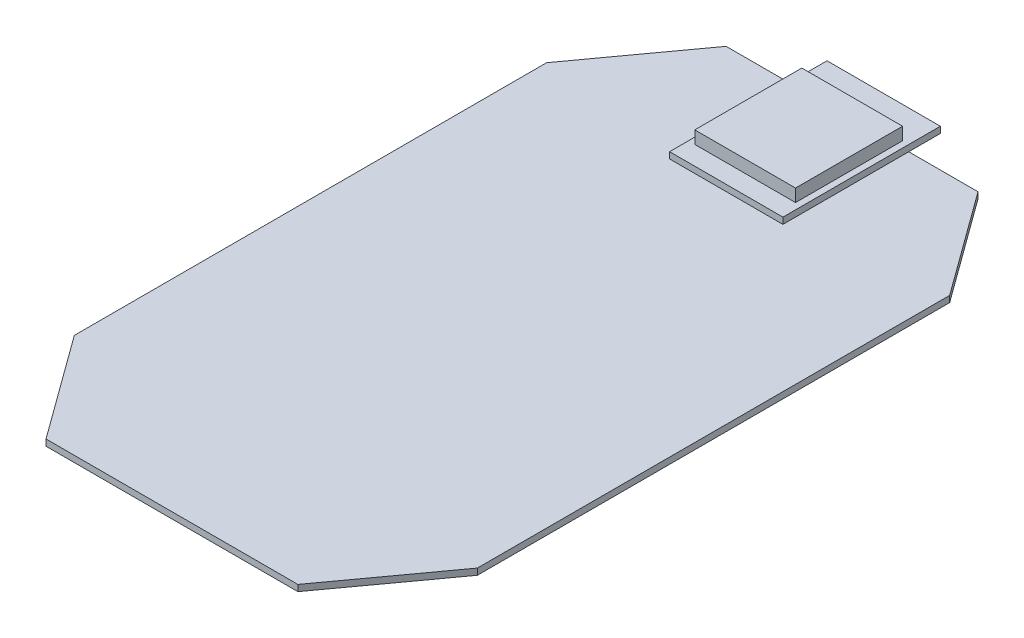
ISO-10303-21;
HEADER;
FILE_DESCRIPTION(('STEP AP214'),'2;1');
FILE_NAME('part.step','',(''),(''),'','','');
FILE_SCHEMA(('AUTOMOTIVE_DESIGN { 1 0 10303 214 1 1 1 1 }'));
ENDSEC;
DATA;
#1=APPLICATION_CONTEXT('core data for automotive mechanical design processes');
#2=APPLICATION_PROTOCOL_DEFINITION('international standard','automotive_design',2000,#1);
#3=PRODUCT_CONTEXT('',#1,'mechanical');
#4=PRODUCT('Part','Part','',(#3));
#5=PRODUCT_RELATED_PRODUCT_CATEGORY('part','',(#4));
#6=PRODUCT_DEFINITION_FORMATION('','',#4);
#7=PRODUCT_DEFINITION_CONTEXT('part definition',#1,'design');
#8=PRODUCT_DEFINITION('design','',#6,#7);
#9=PRODUCT_DEFINITION_SHAPE('','',#8);
#10=(LENGTH_UNIT() NAMED_UNIT(*) SI_UNIT(.MILLI.,.METRE.));
#11=(NAMED_UNIT(*) PLANE_ANGLE_UNIT() SI_UNIT($,.RADIAN.));
#12=(NAMED_UNIT(*) SI_UNIT($,.STERADIAN.) SOLID_ANGLE_UNIT());
#13=UNCERTAINTY_MEASURE_WITH_UNIT(LENGTH_MEASURE(1.E-05),#10,'distance_accuracy_value','');
#14=(GEOMETRIC_REPRESENTATION_CONTEXT(3) GLOBAL_UNCERTAINTY_ASSIGNED_CONTEXT((#13)) GLOBAL_UNIT_ASSIGNED_CONTEXT((#10,
#11,#12)) REPRESENTATION_CONTEXT('',''));
#15=CARTESIAN_POINT('',(0.,0.,0.));
#16=DIRECTION('',(0.,0.,1.));
#17=DIRECTION('',(1.,0.,0.));
#18=AXIS2_PLACEMENT_3D('',#15,#16,#17);
#19=CARTESIAN_POINT('',(-51.372972972973,1.,-37.3621621621621));
#20=DIRECTION('',(-0.808736084303189,0.,-0.588171697675046));
#21=DIRECTION('',(-0.588171697675046,0.,0.808736084303189));
#22=AXIS2_PLACEMENT_3D('',#19,#20,#21);
#23=PLANE('',#22);
#24=DIRECTION('',(0.588171697675046,0.,-0.808736084303189));
#25=VECTOR('',#24,1.);
#26=CARTESIAN_POINT('',(-51.372972972973,0.,-37.3621621621621));
#27=LINE('',#26,#25);
#28=CARTESIAN_POINT('',(-12.,0.,-91.5));
#29=VERTEX_POINT('',#28);
#30=CARTESIAN_POINT('',(0.,0.,-108.));
#31=VERTEX_POINT('',#30);
#32=EDGE_CURVE('E214',#29,#31,#27,.T.);
#33=ORIENTED_EDGE('',*,*,#32,.F.);
#34=DIRECTION('',(0.,-1.,0.));
#35=VECTOR('',#34,1.);
#36=CARTESIAN_POINT('',(-12.,1.,-91.5));
#37=LINE('',#36,#35);
#38=CARTESIAN_POINT('',(-12.,1.,-91.5));
#39=VERTEX_POINT('',#38);
#40=EDGE_CURVE('E45',#39,#29,#37,.T.);
#41=ORIENTED_EDGE('',*,*,#40,.F.);
#42=DIRECTION('',(0.588171697675046,0.,-0.808736084303189));
#43=VECTOR('',#42,1.);
#44=CARTESIAN_POINT('',(-51.372972972973,1.,-37.3621621621621));
#45=LINE('',#44,#43);
#46=CARTESIAN_POINT('',(0.,1.,-108.));
#47=VERTEX_POINT('',#46);
#48=EDGE_CURVE('E239',#39,#47,#45,.T.);
#49=ORIENTED_EDGE('',*,*,#48,.T.);
#50=DIRECTION('',(0.,-1.,0.));
#51=VECTOR('',#50,1.);
#52=CARTESIAN_POINT('',(0.,1.,-108.));
#53=LINE('',#52,#51);
#54=EDGE_CURVE('E180',#47,#31,#53,.T.);
#55=ORIENTED_EDGE('',*,*,#54,.T.);
#56=EDGE_LOOP('',(#33,#41,#49,#55));
#57=FACE_BOUND('',#56,.T.);
#58=ADVANCED_FACE('F38',(#57),#23,.T.);
#59=CARTESIAN_POINT('',(-12.,1.,0.));
#60=DIRECTION('',(-1.,0.,0.));
#61=DIRECTION('',(0.,0.,1.));
#62=AXIS2_PLACEMENT_3D('',#59,#60,#61);
#63=PLANE('',#62);
#64=DIRECTION('',(0.,0.,-1.));
#65=VECTOR('',#64,1.);
#66=CARTESIAN_POINT('',(-12.,0.,0.));
#67=LINE('',#66,#65);
#68=CARTESIAN_POINT('',(-12.,0.,-16.5));
#69=VERTEX_POINT('',#68);
#70=EDGE_CURVE('E207',#69,#29,#67,.T.);
#71=ORIENTED_EDGE('',*,*,#70,.F.);
#72=DIRECTION('',(0.,-1.,0.));
#73=VECTOR('',#72,1.);
#74=CARTESIAN_POINT('',(-12.,1.,-16.5));
#75=LINE('',#74,#73);
#76=CARTESIAN_POINT('',(-12.,1.,-16.5));
#77=VERTEX_POINT('',#76);
#78=EDGE_CURVE('E200',#77,#69,#75,.T.);
#79=ORIENTED_EDGE('',*,*,#78,.F.);
#80=DIRECTION('',(0.,0.,-1.));
#81=VECTOR('',#80,1.);
#82=CARTESIAN_POINT('',(-12.,1.,0.));
#83=LINE('',#82,#81);
#84=EDGE_CURVE('E209',#77,#39,#83,.T.);
#85=ORIENTED_EDGE('',*,*,#84,.T.);
#86=ORIENTED_EDGE('',*,*,#40,.T.);
#87=EDGE_LOOP('',(#71,#79,#85,#86));
#88=FACE_BOUND('',#87,.T.);
#89=ADVANCED_FACE('F205',(#88),#63,.T.);
#90=CARTESIAN_POINT('',(0.,1.,0.));
#91=DIRECTION('',(0.808736084303189,0.,-0.588171697675046));
#92=DIRECTION('',(-0.588171697675046,0.,-0.808736084303189));
#93=AXIS2_PLACEMENT_3D('',#90,#91,#92);
#94=PLANE('',#93);
#95=DIRECTION('',(0.588171697675046,0.,0.808736084303189));
#96=VECTOR('',#95,1.);
#97=CARTESIAN_POINT('',(0.,0.,0.));
#98=LINE('',#97,#96);
#99=CARTESIAN_POINT('',(0.,0.,0.));
#100=VERTEX_POINT('',#99);
#101=EDGE_CURVE('E223',#69,#100,#98,.T.);
#102=ORIENTED_EDGE('',*,*,#101,.T.);
#103=DIRECTION('',(0.,-1.,0.));
#104=VECTOR('',#103,1.);
#105=CARTESIAN_POINT('',(0.,1.,0.));
#106=LINE('',#105,#104);
#107=CARTESIAN_POINT('',(0.,1.,0.));
#108=VERTEX_POINT('',#107);
#109=EDGE_CURVE('E197',#108,#100,#106,.T.);
#110=ORIENTED_EDGE('',*,*,#109,.F.);
#111=DIRECTION('',(0.588171697675046,0.,0.808736084303189));
#112=VECTOR('',#111,1.);
#113=CARTESIAN_POINT('',(0.,1.,0.));
#114=LINE('',#113,#112);
#115=EDGE_CURVE('E242',#77,#108,#114,.T.);
#116=ORIENTED_EDGE('',*,*,#115,.F.);
#117=ORIENTED_EDGE('',*,*,#78,.T.);
#118=EDGE_LOOP('',(#102,#110,#116,#117));
#119=FACE_BOUND('',#118,.T.);
#120=ADVANCED_FACE('F276',(#119),#94,.F.);
#121=CARTESIAN_POINT('',(0.,1.,0.));
#122=DIRECTION('',(0.,0.,-1.));
#123=DIRECTION('',(-1.,0.,0.));
#124=AXIS2_PLACEMENT_3D('',#121,#122,#123);
#125=PLANE('',#124);
#126=DIRECTION('',(1.,0.,0.));
#127=VECTOR('',#126,1.);
#128=CARTESIAN_POINT('',(0.,0.,0.));
#129=LINE('',#128,#127);
#130=CARTESIAN_POINT('',(40.,0.,0.));
#131=VERTEX_POINT('',#130);
#132=EDGE_CURVE('E225',#100,#131,#129,.T.);
#133=ORIENTED_EDGE('',*,*,#132,.T.);
#134=DIRECTION('',(0.,-1.,0.));
#135=VECTOR('',#134,1.);
#136=CARTESIAN_POINT('',(40.,1.,0.));
#137=LINE('',#136,#135);
#138=CARTESIAN_POINT('',(40.,1.,0.));
#139=VERTEX_POINT('',#138);
#140=EDGE_CURVE('E195',#139,#131,#137,.T.);
#141=ORIENTED_EDGE('',*,*,#140,.F.);
#142=DIRECTION('',(1.,0.,0.));
#143=VECTOR('',#142,1.);
#144=CARTESIAN_POINT('',(0.,1.,0.));
#145=LINE('',#144,#143);
#146=EDGE_CURVE('E248',#108,#139,#145,.T.);
#147=ORIENTED_EDGE('',*,*,#146,.F.);
#148=ORIENTED_EDGE('',*,*,#109,.T.);
#149=EDGE_LOOP('',(#133,#141,#147,#148));
#150=FACE_BOUND('',#149,.T.);
#151=ADVANCED_FACE('F280',(#150),#125,.F.);
#152=CARTESIAN_POINT('',(26.1621621621621,1.,19.027027027027));
#153=DIRECTION('',(0.808736084303188,0.,0.588171697675047));
#154=DIRECTION('',(0.588171697675047,0.,-0.808736084303188));
#155=AXIS2_PLACEMENT_3D('',#152,#153,#154);
#156=PLANE('',#155);
#157=DIRECTION('',(-0.588171697675047,0.,0.808736084303188));
#158=VECTOR('',#157,1.);
#159=CARTESIAN_POINT('',(26.1621621621621,0.,19.027027027027));
#160=LINE('',#159,#158);
#161=CARTESIAN_POINT('',(52.,0.,-16.5));
#162=VERTEX_POINT('',#161);
#163=EDGE_CURVE('E231',#162,#131,#160,.T.);
#164=ORIENTED_EDGE('',*,*,#163,.F.);
#165=DIRECTION('',(0.,-1.,0.));
#166=VECTOR('',#165,1.);
#167=CARTESIAN_POINT('',(52.,1.,-16.5));
#168=LINE('',#167,#166);
#169=CARTESIAN_POINT('',(52.,1.,-16.5));
#170=VERTEX_POINT('',#169);
#171=EDGE_CURVE('E193',#170,#162,#168,.T.);
#172=ORIENTED_EDGE('',*,*,#171,.F.);
#173=DIRECTION('',(-0.588171697675047,0.,0.808736084303188));
#174=VECTOR('',#173,1.);
#175=CARTESIAN_POINT('',(26.1621621621621,1.,19.027027027027));
#176=LINE('',#175,#174);
#177=EDGE_CURVE('E250',#170,#139,#176,.T.);
#178=ORIENTED_EDGE('',*,*,#177,.T.);
#179=ORIENTED_EDGE('',*,*,#140,.T.);
#180=EDGE_LOOP('',(#164,#172,#178,#179));
#181=FACE_BOUND('',#180,.T.);
#182=ADVANCED_FACE('F286',(#181),#156,.T.);
#183=CARTESIAN_POINT('',(52.,1.,0.));
#184=DIRECTION('',(-1.,0.,0.));
#185=DIRECTION('',(0.,0.,1.));
#186=AXIS2_PLACEMENT_3D('',#183,#184,#185);
#187=PLANE('',#186);
#188=DIRECTION('',(0.,0.,-1.));
#189=VECTOR('',#188,1.);
#190=CARTESIAN_POINT('',(52.,0.,0.));
#191=LINE('',#190,#189);
#192=CARTESIAN_POINT('',(52.,0.,-91.5));
#193=VERTEX_POINT('',#192);
#194=EDGE_CURVE('E234',#162,#193,#191,.T.);
#195=ORIENTED_EDGE('',*,*,#194,.T.);
#196=DIRECTION('',(0.,-1.,0.));
#197=VECTOR('',#196,1.);
#198=CARTESIAN_POINT('',(52.,1.,-91.5));
#199=LINE('',#198,#197);
#200=CARTESIAN_POINT('',(52.,1.,-91.5));
#201=VERTEX_POINT('',#200);
#202=EDGE_CURVE('E190',#201,#193,#199,.T.);
#203=ORIENTED_EDGE('',*,*,#202,.F.);
#204=DIRECTION('',(0.,0.,-1.));
#205=VECTOR('',#204,1.);
#206=CARTESIAN_POINT('',(52.,1.,0.));
#207=LINE('',#206,#205);
#208=EDGE_CURVE('E253',#170,#201,#207,.T.);
#209=ORIENTED_EDGE('',*,*,#208,.F.);
#210=ORIENTED_EDGE('',*,*,#171,.T.);
#211=EDGE_LOOP('',(#195,#203,#209,#210));
#212=FACE_BOUND('',#211,.T.);
#213=ADVANCED_FACE('F290',(#212),#187,.F.);
#214=CARTESIAN_POINT('',(77.5351351351351,1.,-56.3891891891892));
#215=DIRECTION('',(-0.808736084303189,0.,0.588171697675046));
#216=DIRECTION('',(0.588171697675046,0.,0.808736084303189));
#217=AXIS2_PLACEMENT_3D('',#214,#215,#216);
#218=PLANE('',#217);
#219=DIRECTION('',(-0.588171697675046,0.,-0.808736084303189));
#220=VECTOR('',#219,1.);
#221=CARTESIAN_POINT('',(77.5351351351351,0.,-56.3891891891892));
#222=LINE('',#221,#220);
#223=CARTESIAN_POINT('',(40.,0.,-108.));
#224=VERTEX_POINT('',#223);
#225=EDGE_CURVE('E236',#193,#224,#222,.T.);
#226=ORIENTED_EDGE('',*,*,#225,.T.);
#227=DIRECTION('',(0.,-1.,0.));
#228=VECTOR('',#227,1.);
#229=CARTESIAN_POINT('',(40.,1.,-108.));
#230=LINE('',#229,#228);
#231=CARTESIAN_POINT('',(40.,1.,-108.));
#232=VERTEX_POINT('',#231);
#233=EDGE_CURVE('E182',#232,#224,#230,.T.);
#234=ORIENTED_EDGE('',*,*,#233,.F.);
#235=DIRECTION('',(-0.588171697675046,0.,-0.808736084303189));
#236=VECTOR('',#235,1.);
#237=CARTESIAN_POINT('',(77.5351351351351,1.,-56.3891891891892));
#238=LINE('',#237,#236);
#239=EDGE_CURVE('E255',#201,#232,#238,.T.);
#240=ORIENTED_EDGE('',*,*,#239,.F.);
#241=ORIENTED_EDGE('',*,*,#202,.T.);
#242=EDGE_LOOP('',(#226,#234,#240,#241));
#243=FACE_BOUND('',#242,.T.);
#244=ADVANCED_FACE('F294',(#243),#218,.F.);
#245=CARTESIAN_POINT('',(29.,1.,0.));
#246=DIRECTION('',(1.,0.,0.));
#247=DIRECTION('',(0.,0.,-1.));
#248=AXIS2_PLACEMENT_3D('',#245,#246,#247);
#249=PLANE('',#248);
#250=DIRECTION('',(0.,0.,1.));
#251=VECTOR('',#250,1.);
#252=CARTESIAN_POINT('',(29.,1.,-108.));
#253=LINE('',#252,#251);
#254=CARTESIAN_POINT('',(29.,1.,-113.023609271807));
#255=VERTEX_POINT('',#254);
#256=CARTESIAN_POINT('',(29.,1.,-108.));
#257=VERTEX_POINT('',#256);
#258=EDGE_CURVE('E174',#255,#257,#253,.T.);
#259=ORIENTED_EDGE('',*,*,#258,.F.);
#260=DIRECTION('',(0.,-1.,0.));
#261=VECTOR('',#260,1.);
#262=CARTESIAN_POINT('',(29.,1.,-113.023609271807));
#263=LINE('',#262,#261);
#264=CARTESIAN_POINT('',(29.,2.,-113.023609271807));
#265=VERTEX_POINT('',#264);
#266=EDGE_CURVE('E173',#265,#255,#263,.T.);
#267=ORIENTED_EDGE('',*,*,#266,.F.);
#268=DIRECTION('',(0.,0.,1.));
#269=VECTOR('',#268,1.);
#270=CARTESIAN_POINT('',(29.,2.,-113.023609271807));
#271=LINE('',#270,#269);
#272=CARTESIAN_POINT('',(29.,2.,-88.0236092718068));
#273=VERTEX_POINT('',#272);
#274=EDGE_CURVE('E512',#265,#273,#271,.T.);
#275=ORIENTED_EDGE('',*,*,#274,.T.);
#276=DIRECTION('',(0.,-1.,0.));
#277=VECTOR('',#276,1.);
#278=CARTESIAN_POINT('',(29.,2.,-88.0236092718068));
#279=LINE('',#278,#277);
#280=CARTESIAN_POINT('',(29.,1.,-88.0236092718068));
#281=VERTEX_POINT('',#280);
#282=EDGE_CURVE('E505',#273,#281,#279,.T.);
#283=ORIENTED_EDGE('',*,*,#282,.T.);
#284=DIRECTION('',(0.,0.,1.));
#285=VECTOR('',#284,1.);
#286=CARTESIAN_POINT('',(29.,1.,-113.023609271807));
#287=LINE('',#286,#285);
#288=EDGE_CURVE('E52',#257,#281,#287,.T.);
#289=ORIENTED_EDGE('',*,*,#288,.F.);
#290=EDGE_LOOP('',(#259,#267,#275,#283,#289));
#291=FACE_BOUND('',#290,.T.);
#292=ADVANCED_FACE('F298',(#291),#249,.T.);
#293=CARTESIAN_POINT('',(0.,1.,-113.023609271807));
#294=DIRECTION('',(0.,0.,-1.));
#295=DIRECTION('',(-1.,0.,0.));
#296=AXIS2_PLACEMENT_3D('',#293,#294,#295);
#297=PLANE('',#296);
#298=DIRECTION('',(1.,0.,0.));
#299=VECTOR('',#298,1.);
#300=CARTESIAN_POINT('',(29.,1.,-113.023609271807));
#301=LINE('',#300,#299);
#302=CARTESIAN_POINT('',(11.,1.,-113.023609271807));
#303=VERTEX_POINT('',#302);
#304=EDGE_CURVE('E158',#303,#255,#301,.T.);
#305=ORIENTED_EDGE('',*,*,#304,.F.);
#306=DIRECTION('',(0.,-1.,0.));
#307=VECTOR('',#306,1.);
#308=CARTESIAN_POINT('',(11.,1.,-113.023609271807));
#309=LINE('',#308,#307);
#310=CARTESIAN_POINT('',(11.,2.,-113.023609271807));
#311=VERTEX_POINT('',#310);
#312=EDGE_CURVE('E171',#311,#303,#309,.T.);
#313=ORIENTED_EDGE('',*,*,#312,.F.);
#314=DIRECTION('',(1.,0.,0.));
#315=VECTOR('',#314,1.);
#316=CARTESIAN_POINT('',(11.,2.,-113.023609271807));
#317=LINE('',#316,#315);
#318=EDGE_CURVE('E554',#311,#265,#317,.T.);
#319=ORIENTED_EDGE('',*,*,#318,.T.);
#320=ORIENTED_EDGE('',*,*,#266,.T.);
#321=EDGE_LOOP('',(#305,#313,#319,#320));
#322=FACE_BOUND('',#321,.T.);
#323=ADVANCED_FACE('F169',(#322),#297,.T.);
#324=CARTESIAN_POINT('',(11.,1.,0.));
#325=DIRECTION('',(-1.,0.,0.));
#326=DIRECTION('',(0.,0.,1.));
#327=AXIS2_PLACEMENT_3D('',#324,#325,#326);
#328=PLANE('',#327);
#329=DIRECTION('',(0.,0.,-1.));
#330=VECTOR('',#329,1.);
#331=CARTESIAN_POINT('',(11.,1.,-113.023609271807));
#332=LINE('',#331,#330);
#333=CARTESIAN_POINT('',(11.,1.,-108.));
#334=VERTEX_POINT('',#333);
#335=EDGE_CURVE('E155',#334,#303,#332,.T.);
#336=ORIENTED_EDGE('',*,*,#335,.F.);
#337=DIRECTION('',(0.,0.,-1.));
#338=VECTOR('',#337,1.);
#339=CARTESIAN_POINT('',(11.,1.,-88.0236092718068));
#340=LINE('',#339,#338);
#341=CARTESIAN_POINT('',(11.,1.,-88.0236092718068));
#342=VERTEX_POINT('',#341);
#343=EDGE_CURVE('E261',#342,#334,#340,.T.);
#344=ORIENTED_EDGE('',*,*,#343,.F.);
#345=DIRECTION('',(0.,-1.,0.));
#346=VECTOR('',#345,1.);
#347=CARTESIAN_POINT('',(11.,2.,-88.0236092718068));
#348=LINE('',#347,#346);
#349=CARTESIAN_POINT('',(11.,2.,-88.0236092718068));
#350=VERTEX_POINT('',#349);
#351=EDGE_CURVE('E507',#350,#342,#348,.T.);
#352=ORIENTED_EDGE('',*,*,#351,.F.);
#353=DIRECTION('',(0.,0.,-1.));
#354=VECTOR('',#353,1.);
#355=CARTESIAN_POINT('',(11.,2.,-88.0236092718068));
#356=LINE('',#355,#354);
#357=EDGE_CURVE('E179',#350,#311,#356,.T.);
#358=ORIENTED_EDGE('',*,*,#357,.T.);
#359=ORIENTED_EDGE('',*,*,#312,.T.);
#360=EDGE_LOOP('',(#336,#344,#352,#358,#359));
#361=FACE_BOUND('',#360,.T.);
#362=ADVANCED_FACE('F177',(#361),#328,.T.);
#363=CARTESIAN_POINT('',(0.,1.,-108.));
#364=DIRECTION('',(0.,0.,1.));
#365=DIRECTION('',(1.,0.,0.));
#366=AXIS2_PLACEMENT_3D('',#363,#364,#365);
#367=PLANE('',#366);
#368=DIRECTION('',(-1.,0.,0.));
#369=VECTOR('',#368,1.);
#370=CARTESIAN_POINT('',(0.,0.,-108.));
#371=LINE('',#370,#369);
#372=EDGE_CURVE('E238',#224,#31,#371,.T.);
#373=ORIENTED_EDGE('',*,*,#372,.T.);
#374=ORIENTED_EDGE('',*,*,#54,.F.);
#375=DIRECTION('',(-1.,0.,0.));
#376=VECTOR('',#375,1.);
#377=CARTESIAN_POINT('',(0.,1.,-108.));
#378=LINE('',#377,#376);
#379=EDGE_CURVE('E184',#334,#47,#378,.T.);
#380=ORIENTED_EDGE('',*,*,#379,.F.);
#381=DIRECTION('',(-1.,0.,0.));
#382=VECTOR('',#381,1.);
#383=CARTESIAN_POINT('',(11.,1.,-108.));
#384=LINE('',#383,#382);
#385=EDGE_CURVE('E161',#257,#334,#384,.T.);
#386=ORIENTED_EDGE('',*,*,#385,.F.);
#387=DIRECTION('',(1.,0.,0.));
#388=VECTOR('',#387,1.);
#389=CARTESIAN_POINT('',(0.,1.,-108.));
#390=LINE('',#389,#388);
#391=EDGE_CURVE('E257',#257,#232,#390,.T.);
#392=ORIENTED_EDGE('',*,*,#391,.T.);
#393=ORIENTED_EDGE('',*,*,#233,.T.);
#394=EDGE_LOOP('',(#373,#374,#380,#386,#392,#393));
#395=FACE_BOUND('',#394,.T.);
#396=ADVANCED_FACE('F262',(#395),#367,.F.);
#397=CARTESIAN_POINT('',(0.,1.,0.));
#398=DIRECTION('',(0.,1.,0.));
#399=DIRECTION('',(0.,0.,1.));
#400=AXIS2_PLACEMENT_3D('',#397,#398,#399);
#401=PLANE('',#400);
#402=ORIENTED_EDGE('',*,*,#288,.T.);
#403=DIRECTION('',(-1.,0.,0.));
#404=VECTOR('',#403,1.);
#405=CARTESIAN_POINT('',(29.,1.,-88.0236092718068));
#406=LINE('',#405,#404);
#407=EDGE_CURVE('E503',#281,#342,#406,.T.);
#408=ORIENTED_EDGE('',*,*,#407,.T.);
#409=ORIENTED_EDGE('',*,*,#343,.T.);
#410=ORIENTED_EDGE('',*,*,#379,.T.);
#411=ORIENTED_EDGE('',*,*,#48,.F.);
#412=ORIENTED_EDGE('',*,*,#84,.F.);
#413=ORIENTED_EDGE('',*,*,#115,.T.);
#414=ORIENTED_EDGE('',*,*,#146,.T.);
#415=ORIENTED_EDGE('',*,*,#177,.F.);
#416=ORIENTED_EDGE('',*,*,#208,.T.);
#417=ORIENTED_EDGE('',*,*,#239,.T.);
#418=ORIENTED_EDGE('',*,*,#391,.F.);
#419=EDGE_LOOP('',(#402,#408,#409,#410,#411,#412,#413,#414,#415,#416,#417,#418));
#420=FACE_BOUND('',#419,.T.);
#421=ADVANCED_FACE('F260',(#420),#401,.T.);
#422=CARTESIAN_POINT('',(0.,0.,0.));
#423=DIRECTION('',(0.,1.,0.));
#424=DIRECTION('',(0.,0.,1.));
#425=AXIS2_PLACEMENT_3D('',#422,#423,#424);
#426=PLANE('',#425);
#427=ORIENTED_EDGE('',*,*,#372,.F.);
#428=ORIENTED_EDGE('',*,*,#225,.F.);
#429=ORIENTED_EDGE('',*,*,#194,.F.);
#430=ORIENTED_EDGE('',*,*,#163,.T.);
#431=ORIENTED_EDGE('',*,*,#132,.F.);
#432=ORIENTED_EDGE('',*,*,#101,.F.);
#433=ORIENTED_EDGE('',*,*,#70,.T.);
#434=ORIENTED_EDGE('',*,*,#32,.T.);
#435=EDGE_LOOP('',(#427,#428,#429,#430,#431,#432,#433,#434));
#436=FACE_BOUND('',#435,.T.);
#437=ADVANCED_FACE('F221',(#436),#426,.F.);
#438=CARTESIAN_POINT('',(29.,2.,-88.0236092718068));
#439=DIRECTION('',(0.,0.,1.));
#440=DIRECTION('',(1.,0.,0.));
#441=AXIS2_PLACEMENT_3D('',#438,#439,#440);
#442=PLANE('',#441);
#443=ORIENTED_EDGE('',*,*,#407,.F.);
#444=ORIENTED_EDGE('',*,*,#282,.F.);
#445=DIRECTION('',(-1.,0.,0.));
#446=VECTOR('',#445,1.);
#447=CARTESIAN_POINT('',(29.,2.,-88.0236092718068));
#448=LINE('',#447,#446);
#449=EDGE_CURVE('E516',#273,#350,#448,.T.);
#450=ORIENTED_EDGE('',*,*,#449,.T.);
#451=ORIENTED_EDGE('',*,*,#351,.T.);
#452=EDGE_LOOP('',(#443,#444,#450,#451));
#453=FACE_BOUND('',#452,.T.);
#454=ADVANCED_FACE('F337',(#453),#442,.T.);
#455=CARTESIAN_POINT('',(0.,2.,0.));
#456=DIRECTION('',(0.,-1.,0.));
#457=DIRECTION('',(0.,0.,-1.));
#458=AXIS2_PLACEMENT_3D('',#455,#456,#457);
#459=PLANE('',#458);
#460=DIRECTION('',(-1.,0.,0.));
#461=VECTOR('',#460,1.);
#462=CARTESIAN_POINT('',(0.,2.,-108.023609271807));
#463=LINE('',#462,#461);
#464=CARTESIAN_POINT('',(28.,2.,-108.023609271807));
#465=VERTEX_POINT('',#464);
#466=CARTESIAN_POINT('',(12.,2.,-108.023609271807));
#467=VERTEX_POINT('',#466);
#468=EDGE_CURVE('E60',#465,#467,#463,.T.);
#469=ORIENTED_EDGE('',*,*,#468,.F.);
#470=DIRECTION('',(0.,0.,-1.));
#471=VECTOR('',#470,1.);
#472=CARTESIAN_POINT('',(28.,2.,0.));
#473=LINE('',#472,#471);
#474=CARTESIAN_POINT('',(28.,2.,-91.0236092718068));
#475=VERTEX_POINT('',#474);
#476=EDGE_CURVE('E11',#475,#465,#473,.T.);
#477=ORIENTED_EDGE('',*,*,#476,.F.);
#478=DIRECTION('',(1.,0.,0.));
#479=VECTOR('',#478,1.);
#480=CARTESIAN_POINT('',(0.,2.,-91.0236092718068));
#481=LINE('',#480,#479);
#482=CARTESIAN_POINT('',(12.,2.,-91.0236092718068));
#483=VERTEX_POINT('',#482);
#484=EDGE_CURVE('E518',#483,#475,#481,.T.);
#485=ORIENTED_EDGE('',*,*,#484,.F.);
#486=DIRECTION('',(0.,0.,1.));
#487=VECTOR('',#486,1.);
#488=CARTESIAN_POINT('',(12.,2.,0.));
#489=LINE('',#488,#487);
#490=EDGE_CURVE('E522',#467,#483,#489,.T.);
#491=ORIENTED_EDGE('',*,*,#490,.F.);
#492=EDGE_LOOP('',(#469,#477,#485,#491));
#493=FACE_BOUND('',#492,.T.);
#494=ORIENTED_EDGE('',*,*,#449,.F.);
#495=ORIENTED_EDGE('',*,*,#274,.F.);
#496=ORIENTED_EDGE('',*,*,#318,.F.);
#497=ORIENTED_EDGE('',*,*,#357,.F.);
#498=EDGE_LOOP('',(#494,#495,#496,#497));
#499=FACE_BOUND('',#498,.T.);
#500=ADVANCED_FACE('F388',(#493,#499),#459,.F.);
#501=CARTESIAN_POINT('',(0.,4.,0.));
#502=DIRECTION('',(0.,1.,0.));
#503=DIRECTION('',(0.,0.,1.));
#504=AXIS2_PLACEMENT_3D('',#501,#502,#503);
#505=PLANE('',#504);
#506=DIRECTION('',(1.,0.,0.));
#507=VECTOR('',#506,1.);
#508=CARTESIAN_POINT('',(0.,4.,-108.023609271807));
#509=LINE('',#508,#507);
#510=CARTESIAN_POINT('',(12.,4.,-108.023609271807));
#511=VERTEX_POINT('',#510);
#512=CARTESIAN_POINT('',(28.,4.,-108.023609271807));
#513=VERTEX_POINT('',#512);
#514=EDGE_CURVE('E526',#511,#513,#509,.T.);
#515=ORIENTED_EDGE('',*,*,#514,.F.);
#516=DIRECTION('',(0.,0.,-1.));
#517=VECTOR('',#516,1.);
#518=CARTESIAN_POINT('',(12.,4.,0.));
#519=LINE('',#518,#517);
#520=CARTESIAN_POINT('',(12.,4.,-91.0236092718068));
#521=VERTEX_POINT('',#520);
#522=EDGE_CURVE('E529',#521,#511,#519,.T.);
#523=ORIENTED_EDGE('',*,*,#522,.F.);
#524=DIRECTION('',(-1.,0.,0.));
#525=VECTOR('',#524,1.);
#526=CARTESIAN_POINT('',(0.,4.,-91.0236092718068));
#527=LINE('',#526,#525);
#528=CARTESIAN_POINT('',(28.,4.,-91.0236092718068));
#529=VERTEX_POINT('',#528);
#530=EDGE_CURVE('E532',#529,#521,#527,.T.);
#531=ORIENTED_EDGE('',*,*,#530,.F.);
#532=DIRECTION('',(0.,0.,1.));
#533=VECTOR('',#532,1.);
#534=CARTESIAN_POINT('',(28.,4.,0.));
#535=LINE('',#534,#533);
#536=EDGE_CURVE('E535',#513,#529,#535,.T.);
#537=ORIENTED_EDGE('',*,*,#536,.F.);
#538=EDGE_LOOP('',(#515,#523,#531,#537));
#539=FACE_BOUND('',#538,.T.);
#540=ADVANCED_FACE('F379',(#539),#505,.T.);
#541=CARTESIAN_POINT('',(28.,4.,0.));
#542=DIRECTION('',(1.,0.,0.));
#543=DIRECTION('',(0.,0.,-1.));
#544=AXIS2_PLACEMENT_3D('',#541,#542,#543);
#545=PLANE('',#544);
#546=DIRECTION('',(0.,-1.,0.));
#547=VECTOR('',#546,1.);
#548=CARTESIAN_POINT('',(28.,4.,-91.0236092718068));
#549=LINE('',#548,#547);
#550=EDGE_CURVE('E541',#529,#475,#549,.T.);
#551=ORIENTED_EDGE('',*,*,#550,.T.);
#552=ORIENTED_EDGE('',*,*,#476,.T.);
#553=DIRECTION('',(0.,-1.,0.));
#554=VECTOR('',#553,1.);
#555=CARTESIAN_POINT('',(28.,4.,-108.023609271807));
#556=LINE('',#555,#554);
#557=EDGE_CURVE('E538',#513,#465,#556,.T.);
#558=ORIENTED_EDGE('',*,*,#557,.F.);
#559=ORIENTED_EDGE('',*,*,#536,.T.);
#560=EDGE_LOOP('',(#551,#552,#558,#559));
#561=FACE_BOUND('',#560,.T.);
#562=ADVANCED_FACE('F371',(#561),#545,.T.);
#563=CARTESIAN_POINT('',(0.,4.,-91.0236092718068));
#564=DIRECTION('',(0.,0.,1.));
#565=DIRECTION('',(1.,0.,0.));
#566=AXIS2_PLACEMENT_3D('',#563,#564,#565);
#567=PLANE('',#566);
#568=DIRECTION('',(0.,-1.,0.));
#569=VECTOR('',#568,1.);
#570=CARTESIAN_POINT('',(12.,4.,-91.0236092718068));
#571=LINE('',#570,#569);
#572=EDGE_CURVE('E543',#521,#483,#571,.T.);
#573=ORIENTED_EDGE('',*,*,#572,.T.);
#574=ORIENTED_EDGE('',*,*,#484,.T.);
#575=ORIENTED_EDGE('',*,*,#550,.F.);
#576=ORIENTED_EDGE('',*,*,#530,.T.);
#577=EDGE_LOOP('',(#573,#574,#575,#576));
#578=FACE_BOUND('',#577,.T.);
#579=ADVANCED_FACE('F363',(#578),#567,.T.);
#580=CARTESIAN_POINT('',(12.,4.,0.));
#581=DIRECTION('',(-1.,0.,0.));
#582=DIRECTION('',(0.,0.,1.));
#583=AXIS2_PLACEMENT_3D('',#580,#581,#582);
#584=PLANE('',#583);
#585=DIRECTION('',(0.,-1.,0.));
#586=VECTOR('',#585,1.);
#587=CARTESIAN_POINT('',(12.,4.,-108.023609271807));
#588=LINE('',#587,#586);
#589=EDGE_CURVE('E218',#511,#467,#588,.T.);
#590=ORIENTED_EDGE('',*,*,#589,.T.);
#591=ORIENTED_EDGE('',*,*,#490,.T.);
#592=ORIENTED_EDGE('',*,*,#572,.F.);
#593=ORIENTED_EDGE('',*,*,#522,.T.);
#594=EDGE_LOOP('',(#590,#591,#592,#593));
#595=FACE_BOUND('',#594,.T.);
#596=ADVANCED_FACE('F355',(#595),#584,.T.);
#597=CARTESIAN_POINT('',(0.,4.,-108.023609271807));
#598=DIRECTION('',(0.,0.,-1.));
#599=DIRECTION('',(-1.,0.,0.));
#600=AXIS2_PLACEMENT_3D('',#597,#598,#599);
#601=PLANE('',#600);
#602=ORIENTED_EDGE('',*,*,#557,.T.);
#603=ORIENTED_EDGE('',*,*,#468,.T.);
#604=ORIENTED_EDGE('',*,*,#589,.F.);
#605=ORIENTED_EDGE('',*,*,#514,.T.);
#606=EDGE_LOOP('',(#602,#603,#604,#605));
#607=FACE_BOUND('',#606,.T.);
#608=ADVANCED_FACE('F346',(#607),#601,.T.);
#609=CARTESIAN_POINT('',(0.,1.,0.));
#610=DIRECTION('',(0.,1.,0.));
#611=DIRECTION('',(0.,0.,1.));
#612=AXIS2_PLACEMENT_3D('',#609,#610,#611);
#613=PLANE('',#612);
#614=ORIENTED_EDGE('',*,*,#335,.T.);
#615=ORIENTED_EDGE('',*,*,#304,.T.);
#616=ORIENTED_EDGE('',*,*,#258,.T.);
#617=ORIENTED_EDGE('',*,*,#385,.T.);
#618=EDGE_LOOP('',(#614,#615,#616,#617));
#619=FACE_BOUND('',#618,.T.);
#620=ADVANCED_FACE('F157',(#619),#613,.F.);
#621=CLOSED_SHELL('',(#58,#89,#120,#151,#182,#213,#244,#292,#323,#362,#396,#421,#437,#454,#500,
#540,#562,#579,#596,#608,#620));
#622=MANIFOLD_SOLID_BREP('B2',#621);
#623=ADVANCED_BREP_SHAPE_REPRESENTATION('',(#18,#622),#14);
#624=SHAPE_DEFINITION_REPRESENTATION(#9,#623);
ENDSEC;
END-ISO-10303-21;
